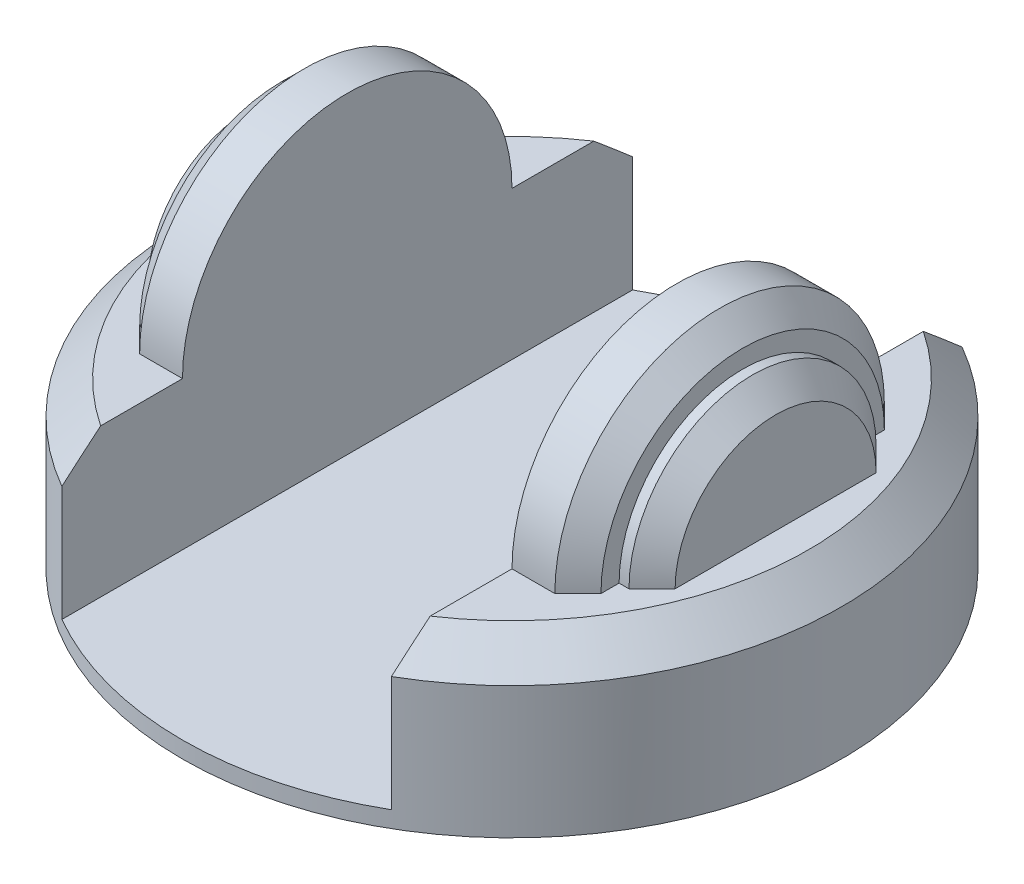
ISO-10303-21;
HEADER;
FILE_DESCRIPTION(('STEP AP214'),'2;1');
FILE_NAME('part.step','',(''),(''),'','','');
FILE_SCHEMA(('AUTOMOTIVE_DESIGN { 1 0 10303 214 1 1 1 1 }'));
ENDSEC;
DATA;
#1=APPLICATION_CONTEXT('core data for automotive mechanical design processes');
#2=APPLICATION_PROTOCOL_DEFINITION('international standard','automotive_design',2000,#1);
#3=PRODUCT_CONTEXT('',#1,'mechanical');
#4=PRODUCT('Part','Part','',(#3));
#5=PRODUCT_RELATED_PRODUCT_CATEGORY('part','',(#4));
#6=PRODUCT_DEFINITION_FORMATION('','',#4);
#7=PRODUCT_DEFINITION_CONTEXT('part definition',#1,'design');
#8=PRODUCT_DEFINITION('design','',#6,#7);
#9=PRODUCT_DEFINITION_SHAPE('','',#8);
#10=(LENGTH_UNIT() NAMED_UNIT(*) SI_UNIT(.MILLI.,.METRE.));
#11=(NAMED_UNIT(*) PLANE_ANGLE_UNIT() SI_UNIT($,.RADIAN.));
#12=(NAMED_UNIT(*) SI_UNIT($,.STERADIAN.) SOLID_ANGLE_UNIT());
#13=UNCERTAINTY_MEASURE_WITH_UNIT(LENGTH_MEASURE(1.E-05),#10,'distance_accuracy_value','');
#14=(GEOMETRIC_REPRESENTATION_CONTEXT(3) GLOBAL_UNCERTAINTY_ASSIGNED_CONTEXT((#13)) GLOBAL_UNIT_ASSIGNED_CONTEXT((#10,
#11,#12)) REPRESENTATION_CONTEXT('',''));
#15=CARTESIAN_POINT('',(0.,0.,0.));
#16=DIRECTION('',(0.,0.,1.));
#17=DIRECTION('',(1.,0.,0.));
#18=AXIS2_PLACEMENT_3D('',#15,#16,#17);
#19=CARTESIAN_POINT('',(0.,50.,0.));
#20=DIRECTION('',(0.,1.,0.));
#21=DIRECTION('',(0.,0.,1.));
#22=AXIS2_PLACEMENT_3D('',#19,#20,#21);
#23=PLANE('',#22);
#24=DIRECTION('',(0.,0.,-1.));
#25=VECTOR('',#24,1.);
#26=CARTESIAN_POINT('',(50.,50.,0.));
#27=LINE('',#26,#25);
#28=CARTESIAN_POINT('',(50.,50.,74.8331477354788));
#29=VERTEX_POINT('',#28);
#30=CARTESIAN_POINT('',(50.,50.,50.));
#31=VERTEX_POINT('',#30);
#32=EDGE_CURVE('E214',#29,#31,#27,.T.);
#33=ORIENTED_EDGE('',*,*,#32,.F.);
#34=CARTESIAN_POINT('',(0.,50.,0.));
#35=DIRECTION('',(0.,1.,0.));
#36=DIRECTION('',(0.,0.,1.));
#37=AXIS2_PLACEMENT_3D('',#34,#35,#36);
#38=CIRCLE('',#37,90.);
#39=CARTESIAN_POINT('',(50.,50.,-74.8331477354788));
#40=VERTEX_POINT('',#39);
#41=EDGE_CURVE('E569',#29,#40,#38,.T.);
#42=ORIENTED_EDGE('',*,*,#41,.T.);
#43=CARTESIAN_POINT('',(50.,50.,-50.));
#44=VERTEX_POINT('',#43);
#45=EDGE_CURVE('E213',#44,#40,#27,.T.);
#46=ORIENTED_EDGE('',*,*,#45,.F.);
#47=DIRECTION('',(-1.,0.,0.));
#48=VECTOR('',#47,1.);
#49=CARTESIAN_POINT('',(70.,50.,-50.));
#50=LINE('',#49,#48);
#51=CARTESIAN_POINT('',(63.,50.,-50.));
#52=VERTEX_POINT('',#51);
#53=EDGE_CURVE('E366',#44,#52,#50,.F.);
#54=ORIENTED_EDGE('',*,*,#53,.T.);
#55=DIRECTION('',(-0.707106781186547,0.,-0.707106781186548));
#56=VECTOR('',#55,1.);
#57=CARTESIAN_POINT('',(113.,50.,0.));
#58=LINE('',#57,#56);
#59=CARTESIAN_POINT('',(70.,50.,-43.));
#60=VERTEX_POINT('',#59);
#61=EDGE_CURVE('E11',#52,#60,#58,.F.);
#62=ORIENTED_EDGE('',*,*,#61,.T.);
#63=DIRECTION('',(0.,0.,1.));
#64=VECTOR('',#63,1.);
#65=CARTESIAN_POINT('',(70.,50.,0.));
#66=LINE('',#65,#64);
#67=CARTESIAN_POINT('',(70.,50.,-37.5));
#68=VERTEX_POINT('',#67);
#69=EDGE_CURVE('E361',#60,#68,#66,.T.);
#70=ORIENTED_EDGE('',*,*,#69,.T.);
#71=DIRECTION('',(-1.,0.,0.));
#72=VECTOR('',#71,1.);
#73=CARTESIAN_POINT('',(80.,50.,-37.5));
#74=LINE('',#73,#72);
#75=CARTESIAN_POINT('',(73.,50.,-37.5));
#76=VERTEX_POINT('',#75);
#77=EDGE_CURVE('E373',#68,#76,#74,.F.);
#78=ORIENTED_EDGE('',*,*,#77,.T.);
#79=DIRECTION('',(-0.707106781186549,0.,-0.707106781186546));
#80=VECTOR('',#79,1.);
#81=CARTESIAN_POINT('',(110.5,50.,0.));
#82=LINE('',#81,#80);
#83=CARTESIAN_POINT('',(80.,50.,-30.5));
#84=VERTEX_POINT('',#83);
#85=EDGE_CURVE('E398',#76,#84,#82,.F.);
#86=ORIENTED_EDGE('',*,*,#85,.T.);
#87=DIRECTION('',(0.,0.,-1.));
#88=VECTOR('',#87,1.);
#89=CARTESIAN_POINT('',(80.,50.,0.));
#90=LINE('',#89,#88);
#91=CARTESIAN_POINT('',(80.,50.,30.5));
#92=VERTEX_POINT('',#91);
#93=EDGE_CURVE('E221',#92,#84,#90,.T.);
#94=ORIENTED_EDGE('',*,*,#93,.F.);
#95=DIRECTION('',(0.707106781186549,0.,-0.707106781186546));
#96=VECTOR('',#95,1.);
#97=CARTESIAN_POINT('',(110.5,50.,0.));
#98=LINE('',#97,#96);
#99=CARTESIAN_POINT('',(73.,50.,37.5));
#100=VERTEX_POINT('',#99);
#101=EDGE_CURVE('E395',#92,#100,#98,.F.);
#102=ORIENTED_EDGE('',*,*,#101,.T.);
#103=DIRECTION('',(-1.,0.,0.));
#104=VECTOR('',#103,1.);
#105=CARTESIAN_POINT('',(80.,50.,37.5));
#106=LINE('',#105,#104);
#107=CARTESIAN_POINT('',(70.,50.,37.5));
#108=VERTEX_POINT('',#107);
#109=EDGE_CURVE('E376',#100,#108,#106,.T.);
#110=ORIENTED_EDGE('',*,*,#109,.T.);
#111=CARTESIAN_POINT('',(70.,50.,43.));
#112=VERTEX_POINT('',#111);
#113=EDGE_CURVE('E363',#108,#112,#66,.T.);
#114=ORIENTED_EDGE('',*,*,#113,.T.);
#115=DIRECTION('',(0.707106781186547,0.,-0.707106781186548));
#116=VECTOR('',#115,1.);
#117=CARTESIAN_POINT('',(113.,50.,0.));
#118=LINE('',#117,#116);
#119=CARTESIAN_POINT('',(63.,50.,50.));
#120=VERTEX_POINT('',#119);
#121=EDGE_CURVE('E44',#112,#120,#118,.F.);
#122=ORIENTED_EDGE('',*,*,#121,.T.);
#123=DIRECTION('',(-1.,0.,0.));
#124=VECTOR('',#123,1.);
#125=CARTESIAN_POINT('',(70.,50.,50.));
#126=LINE('',#125,#124);
#127=EDGE_CURVE('E368',#120,#31,#126,.T.);
#128=ORIENTED_EDGE('',*,*,#127,.T.);
#129=EDGE_LOOP('',(#33,#42,#46,#54,#62,#70,#78,#86,#94,#102,#110,#114,#122,#128));
#130=FACE_BOUND('',#129,.T.);
#131=ADVANCED_FACE('F35',(#130),#23,.T.);
#132=CARTESIAN_POINT('',(0.,50.,0.));
#133=DIRECTION('',(0.,-1.,0.));
#134=DIRECTION('',(0.,0.,-1.));
#135=AXIS2_PLACEMENT_3D('',#132,#133,#134);
#136=CYLINDRICAL_SURFACE('',#135,100.);
#137=DIRECTION('',(0.,-1.,0.));
#138=VECTOR('',#137,1.);
#139=CARTESIAN_POINT('',(-50.,50.,86.6025403784439));
#140=LINE('',#139,#138);
#141=CARTESIAN_POINT('',(-50.,5.,86.6025403784439));
#142=VERTEX_POINT('',#141);
#143=CARTESIAN_POINT('',(-50.,39.9999999999999,86.6025403784439));
#144=VERTEX_POINT('',#143);
#145=EDGE_CURVE('E197',#142,#144,#140,.F.);
#146=ORIENTED_EDGE('',*,*,#145,.T.);
#147=CARTESIAN_POINT('',(0.,39.9999999999999,0.));
#148=DIRECTION('',(0.,1.,0.));
#149=DIRECTION('',(0.,0.,1.));
#150=AXIS2_PLACEMENT_3D('',#147,#148,#149);
#151=CIRCLE('',#150,100.);
#152=CARTESIAN_POINT('',(-50.,39.9999999999999,-86.6025403784439));
#153=VERTEX_POINT('',#152);
#154=EDGE_CURVE('E347',#144,#153,#151,.F.);
#155=ORIENTED_EDGE('',*,*,#154,.T.);
#156=DIRECTION('',(0.,-1.,0.));
#157=VECTOR('',#156,1.);
#158=CARTESIAN_POINT('',(-50.,50.,-86.6025403784439));
#159=LINE('',#158,#157);
#160=CARTESIAN_POINT('',(-50.,5.,-86.6025403784439));
#161=VERTEX_POINT('',#160);
#162=EDGE_CURVE('E200',#153,#161,#159,.T.);
#163=ORIENTED_EDGE('',*,*,#162,.T.);
#164=CARTESIAN_POINT('',(0.,5.,0.));
#165=DIRECTION('',(0.,-1.,0.));
#166=DIRECTION('',(0.,0.,-1.));
#167=AXIS2_PLACEMENT_3D('',#164,#165,#166);
#168=CIRCLE('',#167,100.);
#169=CARTESIAN_POINT('',(50.,5.,-86.6025403784439));
#170=VERTEX_POINT('',#169);
#171=EDGE_CURVE('E217',#161,#170,#168,.T.);
#172=ORIENTED_EDGE('',*,*,#171,.T.);
#173=DIRECTION('',(0.,-1.,0.));
#174=VECTOR('',#173,1.);
#175=CARTESIAN_POINT('',(50.,50.,-86.6025403784439));
#176=LINE('',#175,#174);
#177=CARTESIAN_POINT('',(50.,39.9999999999999,-86.6025403784439));
#178=VERTEX_POINT('',#177);
#179=EDGE_CURVE('E202',#170,#178,#176,.F.);
#180=ORIENTED_EDGE('',*,*,#179,.T.);
#181=CARTESIAN_POINT('',(0.,39.9999999999999,0.));
#182=DIRECTION('',(0.,1.,0.));
#183=DIRECTION('',(0.,0.,1.));
#184=AXIS2_PLACEMENT_3D('',#181,#182,#183);
#185=CIRCLE('',#184,100.);
#186=CARTESIAN_POINT('',(50.,39.9999999999999,86.6025403784439));
#187=VERTEX_POINT('',#186);
#188=EDGE_CURVE('E570',#178,#187,#185,.F.);
#189=ORIENTED_EDGE('',*,*,#188,.T.);
#190=DIRECTION('',(0.,-1.,0.));
#191=VECTOR('',#190,1.);
#192=CARTESIAN_POINT('',(50.,50.,86.6025403784439));
#193=LINE('',#192,#191);
#194=CARTESIAN_POINT('',(50.,5.,86.6025403784439));
#195=VERTEX_POINT('',#194);
#196=EDGE_CURVE('E205',#187,#195,#193,.T.);
#197=ORIENTED_EDGE('',*,*,#196,.T.);
#198=EDGE_CURVE('E220',#195,#142,#168,.T.);
#199=ORIENTED_EDGE('',*,*,#198,.T.);
#200=EDGE_LOOP('',(#146,#155,#163,#172,#180,#189,#197,#199));
#201=FACE_BOUND('',#200,.T.);
#202=CARTESIAN_POINT('',(0.,0.,0.));
#203=DIRECTION('',(0.,1.,0.));
#204=DIRECTION('',(0.,0.,1.));
#205=AXIS2_PLACEMENT_3D('',#202,#203,#204);
#206=CIRCLE('',#205,100.);
#207=CARTESIAN_POINT('',(0.,0.,100.));
#208=VERTEX_POINT('',#207);
#209=EDGE_CURVE('E207',#208,#208,#206,.T.);
#210=ORIENTED_EDGE('',*,*,#209,.T.);
#211=EDGE_LOOP('',(#210));
#212=FACE_BOUND('',#211,.T.);
#213=ADVANCED_FACE('F316',(#201,#212),#136,.T.);
#214=DIRECTION('',(0.,0.,1.));
#215=VECTOR('',#214,1.);
#216=CARTESIAN_POINT('',(-50.,50.,0.));
#217=LINE('',#216,#215);
#218=CARTESIAN_POINT('',(-50.,50.,-74.8331477354788));
#219=VERTEX_POINT('',#218);
#220=CARTESIAN_POINT('',(-50.,50.,-50.));
#221=VERTEX_POINT('',#220);
#222=EDGE_CURVE('E211',#219,#221,#217,.T.);
#223=ORIENTED_EDGE('',*,*,#222,.F.);
#224=CARTESIAN_POINT('',(0.,50.,0.));
#225=DIRECTION('',(0.,1.,0.));
#226=DIRECTION('',(0.,0.,1.));
#227=AXIS2_PLACEMENT_3D('',#224,#225,#226);
#228=CIRCLE('',#227,90.);
#229=CARTESIAN_POINT('',(-50.,50.,74.8331477354788));
#230=VERTEX_POINT('',#229);
#231=EDGE_CURVE('E227',#219,#230,#228,.T.);
#232=ORIENTED_EDGE('',*,*,#231,.T.);
#233=CARTESIAN_POINT('',(-50.,50.,50.));
#234=VERTEX_POINT('',#233);
#235=EDGE_CURVE('E210',#234,#230,#217,.T.);
#236=ORIENTED_EDGE('',*,*,#235,.F.);
#237=DIRECTION('',(1.,0.,0.));
#238=VECTOR('',#237,1.);
#239=CARTESIAN_POINT('',(-70.,50.,50.));
#240=LINE('',#239,#238);
#241=CARTESIAN_POINT('',(-62.9999999999999,50.,50.));
#242=VERTEX_POINT('',#241);
#243=EDGE_CURVE('E187',#242,#234,#240,.T.);
#244=ORIENTED_EDGE('',*,*,#243,.F.);
#245=DIRECTION('',(0.707106781186548,0.,0.707106781186547));
#246=VECTOR('',#245,1.);
#247=CARTESIAN_POINT('',(-113.,50.,0.));
#248=LINE('',#247,#246);
#249=CARTESIAN_POINT('',(-70.,50.,42.9999999999999));
#250=VERTEX_POINT('',#249);
#251=EDGE_CURVE('E402',#242,#250,#248,.F.);
#252=ORIENTED_EDGE('',*,*,#251,.T.);
#253=DIRECTION('',(0.,0.,-1.));
#254=VECTOR('',#253,1.);
#255=CARTESIAN_POINT('',(-70.,50.,0.));
#256=LINE('',#255,#254);
#257=CARTESIAN_POINT('',(-70.,50.,37.5));
#258=VERTEX_POINT('',#257);
#259=EDGE_CURVE('E186',#250,#258,#256,.T.);
#260=ORIENTED_EDGE('',*,*,#259,.T.);
#261=DIRECTION('',(1.,0.,0.));
#262=VECTOR('',#261,1.);
#263=CARTESIAN_POINT('',(-80.,50.,37.5));
#264=LINE('',#263,#262);
#265=CARTESIAN_POINT('',(-73.,50.,37.5));
#266=VERTEX_POINT('',#265);
#267=EDGE_CURVE('E168',#266,#258,#264,.T.);
#268=ORIENTED_EDGE('',*,*,#267,.F.);
#269=DIRECTION('',(0.707106781186545,0.,0.70710678118655));
#270=VECTOR('',#269,1.);
#271=CARTESIAN_POINT('',(-110.5,50.,0.));
#272=LINE('',#271,#270);
#273=CARTESIAN_POINT('',(-80.,50.,30.5));
#274=VERTEX_POINT('',#273);
#275=EDGE_CURVE('E407',#266,#274,#272,.F.);
#276=ORIENTED_EDGE('',*,*,#275,.T.);
#277=DIRECTION('',(0.,0.,1.));
#278=VECTOR('',#277,1.);
#279=CARTESIAN_POINT('',(-80.,50.,0.));
#280=LINE('',#279,#278);
#281=CARTESIAN_POINT('',(-80.,50.,-30.5));
#282=VERTEX_POINT('',#281);
#283=EDGE_CURVE('E224',#282,#274,#280,.T.);
#284=ORIENTED_EDGE('',*,*,#283,.F.);
#285=DIRECTION('',(-0.707106781186545,0.,0.70710678118655));
#286=VECTOR('',#285,1.);
#287=CARTESIAN_POINT('',(-110.5,50.,0.));
#288=LINE('',#287,#286);
#289=CARTESIAN_POINT('',(-73.,50.,-37.5));
#290=VERTEX_POINT('',#289);
#291=EDGE_CURVE('E181',#282,#290,#288,.F.);
#292=ORIENTED_EDGE('',*,*,#291,.T.);
#293=DIRECTION('',(1.,0.,0.));
#294=VECTOR('',#293,1.);
#295=CARTESIAN_POINT('',(-80.,50.,-37.5));
#296=LINE('',#295,#294);
#297=CARTESIAN_POINT('',(-70.,50.,-37.5));
#298=VERTEX_POINT('',#297);
#299=EDGE_CURVE('E165',#298,#290,#296,.F.);
#300=ORIENTED_EDGE('',*,*,#299,.F.);
#301=CARTESIAN_POINT('',(-70.,50.,-42.9999999999999));
#302=VERTEX_POINT('',#301);
#303=EDGE_CURVE('E177',#298,#302,#256,.T.);
#304=ORIENTED_EDGE('',*,*,#303,.T.);
#305=DIRECTION('',(-0.707106781186548,0.,0.707106781186547));
#306=VECTOR('',#305,1.);
#307=CARTESIAN_POINT('',(-113.,50.,0.));
#308=LINE('',#307,#306);
#309=CARTESIAN_POINT('',(-62.9999999999999,50.,-50.));
#310=VERTEX_POINT('',#309);
#311=EDGE_CURVE('E399',#302,#310,#308,.F.);
#312=ORIENTED_EDGE('',*,*,#311,.T.);
#313=DIRECTION('',(1.,0.,0.));
#314=VECTOR('',#313,1.);
#315=CARTESIAN_POINT('',(-70.,50.,-50.));
#316=LINE('',#315,#314);
#317=EDGE_CURVE('E190',#221,#310,#316,.F.);
#318=ORIENTED_EDGE('',*,*,#317,.F.);
#319=EDGE_LOOP('',(#223,#232,#236,#244,#252,#260,#268,#276,#284,#292,#300,#304,#312,#318));
#320=FACE_BOUND('',#319,.T.);
#321=ADVANCED_FACE('F176',(#320),#23,.T.);
#322=CARTESIAN_POINT('',(0.,0.,0.));
#323=DIRECTION('',(0.,1.,0.));
#324=DIRECTION('',(0.,0.,1.));
#325=AXIS2_PLACEMENT_3D('',#322,#323,#324);
#326=PLANE('',#325);
#327=ORIENTED_EDGE('',*,*,#209,.F.);
#328=EDGE_LOOP('',(#327));
#329=FACE_BOUND('',#328,.T.);
#330=ADVANCED_FACE('F323',(#329),#326,.F.);
#331=CARTESIAN_POINT('',(0.,5.,0.));
#332=DIRECTION('',(0.,-1.,0.));
#333=DIRECTION('',(0.,0.,-1.));
#334=AXIS2_PLACEMENT_3D('',#331,#332,#333);
#335=PLANE('',#334);
#336=DIRECTION('',(0.,0.,-1.));
#337=VECTOR('',#336,1.);
#338=CARTESIAN_POINT('',(50.,5.,107.135267779761));
#339=LINE('',#338,#337);
#340=EDGE_CURVE('E189',#195,#170,#339,.T.);
#341=ORIENTED_EDGE('',*,*,#340,.T.);
#342=ORIENTED_EDGE('',*,*,#171,.F.);
#343=DIRECTION('',(0.,0.,1.));
#344=VECTOR('',#343,1.);
#345=CARTESIAN_POINT('',(-50.,5.,107.135267779761));
#346=LINE('',#345,#344);
#347=EDGE_CURVE('E195',#161,#142,#346,.T.);
#348=ORIENTED_EDGE('',*,*,#347,.T.);
#349=ORIENTED_EDGE('',*,*,#198,.F.);
#350=EDGE_LOOP('',(#341,#342,#348,#349));
#351=FACE_BOUND('',#350,.T.);
#352=ADVANCED_FACE('F257',(#351),#335,.F.);
#353=CARTESIAN_POINT('',(50.,5.,107.135267779761));
#354=DIRECTION('',(1.,0.,0.));
#355=DIRECTION('',(0.,0.,-1.));
#356=AXIS2_PLACEMENT_3D('',#353,#354,#355);
#357=PLANE('',#356);
#358=ORIENTED_EDGE('',*,*,#45,.T.);
#359=CARTESIAN_POINT('',(50.,50.,-74.8331477354788));
#360=CARTESIAN_POINT('',(50.,49.1771253740356,-75.8227769251843));
#361=CARTESIAN_POINT('',(50.,48.351296436479,-76.8099446175592));
#362=CARTESIAN_POINT('',(50.,46.6942668321052,-78.7797197788817));
#363=CARTESIAN_POINT('',(50.,45.863066300409,-79.7623273614776));
#364=CARTESIAN_POINT('',(50.,44.1957922637268,-81.7233909233282));
#365=CARTESIAN_POINT('',(50.,43.3597187771789,-82.7018469182673));
#366=CARTESIAN_POINT('',(50.,41.6831009153428,-84.6549639791113));
#367=CARTESIAN_POINT('',(50.,40.8425564285906,-85.6296249493455));
#368=CARTESIAN_POINT('',(50.,39.9999999999999,-86.6025403784439));
#369=B_SPLINE_CURVE_WITH_KNOTS('',3,(#359,#360,#361,#362,#363,#364,#365,#366,#367,#368),
.UNSPECIFIED.,.F.,.F.,(4,2,2,2,4),(0.,3.86112810063912,7.72215945083976,11.5831762013222,
15.4442896640597),.UNSPECIFIED.);
#370=EDGE_CURVE('E274',#40,#178,#369,.T.);
#371=ORIENTED_EDGE('',*,*,#370,.T.);
#372=ORIENTED_EDGE('',*,*,#179,.F.);
#373=ORIENTED_EDGE('',*,*,#340,.F.);
#374=ORIENTED_EDGE('',*,*,#196,.F.);
#375=CARTESIAN_POINT('',(50.,39.9999999999999,86.6025403784439));
#376=CARTESIAN_POINT('',(50.,40.8425564285906,85.6296249493455));
#377=CARTESIAN_POINT('',(50.,41.6831009153428,84.6549639791113));
#378=CARTESIAN_POINT('',(50.,43.3597187771789,82.7018469182673));
#379=CARTESIAN_POINT('',(50.,44.1957922637268,81.7233909233281));
#380=CARTESIAN_POINT('',(50.,45.863066300409,79.7623273614776));
#381=CARTESIAN_POINT('',(50.,46.6942668321052,78.7797197788817));
#382=CARTESIAN_POINT('',(50.,48.351296436479,76.8099446175592));
#383=CARTESIAN_POINT('',(50.,49.1771253740357,75.8227769251843));
#384=CARTESIAN_POINT('',(50.,50.,74.8331477354788));
#385=B_SPLINE_CURVE_WITH_KNOTS('',3,(#375,#376,#377,#378,#379,#380,#381,#382,#383,#384),
.UNSPECIFIED.,.F.,.F.,(4,2,2,2,4),(0.,3.86111346273751,7.72213021321996,11.5831615634206,
15.4442896640597),.UNSPECIFIED.);
#386=EDGE_CURVE('E267',#187,#29,#385,.T.);
#387=ORIENTED_EDGE('',*,*,#386,.T.);
#388=ORIENTED_EDGE('',*,*,#32,.T.);
#389=CARTESIAN_POINT('',(50.,50.,0.));
#390=DIRECTION('',(1.,0.,0.));
#391=DIRECTION('',(0.,0.,-1.));
#392=AXIS2_PLACEMENT_3D('',#389,#390,#391);
#393=CIRCLE('',#392,50.);
#394=EDGE_CURVE('E370',#44,#31,#393,.T.);
#395=ORIENTED_EDGE('',*,*,#394,.F.);
#396=EDGE_LOOP('',(#358,#371,#372,#373,#374,#387,#388,#395));
#397=FACE_BOUND('',#396,.T.);
#398=ADVANCED_FACE('F255',(#397),#357,.F.);
#399=CARTESIAN_POINT('',(-50.,5.,107.135267779761));
#400=DIRECTION('',(-1.,0.,0.));
#401=DIRECTION('',(0.,0.,1.));
#402=AXIS2_PLACEMENT_3D('',#399,#400,#401);
#403=PLANE('',#402);
#404=ORIENTED_EDGE('',*,*,#235,.T.);
#405=CARTESIAN_POINT('',(-50.,50.,74.8331477354788));
#406=CARTESIAN_POINT('',(-50.,49.1771253740356,75.8227769251843));
#407=CARTESIAN_POINT('',(-50.,48.351296436479,76.8099446175592));
#408=CARTESIAN_POINT('',(-50.,46.6942668321052,78.7797197788817));
#409=CARTESIAN_POINT('',(-50.,45.863066300409,79.7623273614776));
#410=CARTESIAN_POINT('',(-50.,44.1957922637268,81.7233909233281));
#411=CARTESIAN_POINT('',(-50.,43.3597187771789,82.7018469182672));
#412=CARTESIAN_POINT('',(-50.,41.6831009153427,84.6549639791113));
#413=CARTESIAN_POINT('',(-50.,40.8425564285906,85.6296249493455));
#414=CARTESIAN_POINT('',(-50.,39.9999999999999,86.6025403784439));
#415=B_SPLINE_CURVE_WITH_KNOTS('',3,(#405,#406,#407,#408,#409,#410,#411,#412,#413,#414),
.UNSPECIFIED.,.F.,.F.,(4,2,2,2,4),(0.,3.86112810063914,7.72215945083976,11.5831762013222,
15.4442896640597),.UNSPECIFIED.);
#416=EDGE_CURVE('E238',#230,#144,#415,.T.);
#417=ORIENTED_EDGE('',*,*,#416,.T.);
#418=ORIENTED_EDGE('',*,*,#145,.F.);
#419=ORIENTED_EDGE('',*,*,#347,.F.);
#420=ORIENTED_EDGE('',*,*,#162,.F.);
#421=CARTESIAN_POINT('',(-50.,39.9999999999999,-86.6025403784439));
#422=CARTESIAN_POINT('',(-50.,40.8425564285906,-85.6296249493455));
#423=CARTESIAN_POINT('',(-50.,41.6831009153428,-84.6549639791113));
#424=CARTESIAN_POINT('',(-50.,43.3597187771788,-82.7018469182673));
#425=CARTESIAN_POINT('',(-50.,44.1957922637267,-81.7233909233281));
#426=CARTESIAN_POINT('',(-50.,45.863066300409,-79.7623273614776));
#427=CARTESIAN_POINT('',(-50.,46.6942668321052,-78.7797197788817));
#428=CARTESIAN_POINT('',(-50.,48.351296436479,-76.8099446175592));
#429=CARTESIAN_POINT('',(-50.,49.1771253740356,-75.8227769251843));
#430=CARTESIAN_POINT('',(-50.,50.,-74.8331477354788));
#431=B_SPLINE_CURVE_WITH_KNOTS('',3,(#421,#422,#423,#424,#425,#426,#427,#428,#429,#430),
.UNSPECIFIED.,.F.,.F.,(4,2,2,2,4),(0.,3.86111346273749,7.72213021321994,11.5831615634206,
15.4442896640597),.UNSPECIFIED.);
#432=EDGE_CURVE('E230',#153,#219,#431,.T.);
#433=ORIENTED_EDGE('',*,*,#432,.T.);
#434=ORIENTED_EDGE('',*,*,#222,.T.);
#435=CARTESIAN_POINT('',(-50.,50.,0.));
#436=DIRECTION('',(1.,0.,0.));
#437=DIRECTION('',(0.,0.,-1.));
#438=AXIS2_PLACEMENT_3D('',#435,#436,#437);
#439=CIRCLE('',#438,50.);
#440=EDGE_CURVE('E358',#221,#234,#439,.T.);
#441=ORIENTED_EDGE('',*,*,#440,.T.);
#442=EDGE_LOOP('',(#404,#417,#418,#419,#420,#433,#434,#441));
#443=FACE_BOUND('',#442,.T.);
#444=ADVANCED_FACE('F249',(#443),#403,.F.);
#445=CARTESIAN_POINT('',(-70.,50.,0.));
#446=DIRECTION('',(1.,0.,0.));
#447=DIRECTION('',(0.,0.,-1.));
#448=AXIS2_PLACEMENT_3D('',#445,#446,#447);
#449=CYLINDRICAL_SURFACE('',#448,50.);
#450=ORIENTED_EDGE('',*,*,#317,.T.);
#451=CARTESIAN_POINT('',(-62.9999999999999,50.,0.));
#452=DIRECTION('',(1.,0.,0.));
#453=DIRECTION('',(0.,0.,-1.));
#454=AXIS2_PLACEMENT_3D('',#451,#452,#453);
#455=CIRCLE('',#454,50.);
#456=EDGE_CURVE('E416',#310,#242,#455,.T.);
#457=ORIENTED_EDGE('',*,*,#456,.T.);
#458=ORIENTED_EDGE('',*,*,#243,.T.);
#459=ORIENTED_EDGE('',*,*,#440,.F.);
#460=EDGE_LOOP('',(#450,#457,#458,#459));
#461=FACE_BOUND('',#460,.T.);
#462=ADVANCED_FACE('F254',(#461),#449,.T.);
#463=CARTESIAN_POINT('',(-70.,50.,0.));
#464=DIRECTION('',(1.,0.,0.));
#465=DIRECTION('',(0.,0.,-1.));
#466=AXIS2_PLACEMENT_3D('',#463,#464,#465);
#467=PLANE('',#466);
#468=ORIENTED_EDGE('',*,*,#259,.F.);
#469=CARTESIAN_POINT('',(-70.,50.,0.));
#470=DIRECTION('',(1.,0.,0.));
#471=DIRECTION('',(0.,0.,-1.));
#472=AXIS2_PLACEMENT_3D('',#469,#470,#471);
#473=CIRCLE('',#472,42.9999999999999);
#474=EDGE_CURVE('E185',#250,#302,#473,.F.);
#475=ORIENTED_EDGE('',*,*,#474,.T.);
#476=ORIENTED_EDGE('',*,*,#303,.F.);
#477=CARTESIAN_POINT('',(-70.,50.,0.));
#478=DIRECTION('',(1.,0.,0.));
#479=DIRECTION('',(0.,0.,-1.));
#480=AXIS2_PLACEMENT_3D('',#477,#478,#479);
#481=CIRCLE('',#480,37.5);
#482=EDGE_CURVE('E161',#298,#258,#481,.T.);
#483=ORIENTED_EDGE('',*,*,#482,.T.);
#484=EDGE_LOOP('',(#468,#475,#476,#483));
#485=FACE_BOUND('',#484,.T.);
#486=ADVANCED_FACE('F183',(#485),#467,.F.);
#487=CARTESIAN_POINT('',(70.,50.,0.));
#488=DIRECTION('',(-1.,0.,0.));
#489=DIRECTION('',(0.,0.,1.));
#490=AXIS2_PLACEMENT_3D('',#487,#488,#489);
#491=CYLINDRICAL_SURFACE('',#490,50.);
#492=ORIENTED_EDGE('',*,*,#127,.F.);
#493=CARTESIAN_POINT('',(63.,50.,0.));
#494=DIRECTION('',(-1.,0.,0.));
#495=DIRECTION('',(0.,0.,1.));
#496=AXIS2_PLACEMENT_3D('',#493,#494,#495);
#497=CIRCLE('',#496,50.);
#498=EDGE_CURVE('E57',#120,#52,#497,.T.);
#499=ORIENTED_EDGE('',*,*,#498,.T.);
#500=ORIENTED_EDGE('',*,*,#53,.F.);
#501=ORIENTED_EDGE('',*,*,#394,.T.);
#502=EDGE_LOOP('',(#492,#499,#500,#501));
#503=FACE_BOUND('',#502,.T.);
#504=ADVANCED_FACE('F426',(#503),#491,.T.);
#505=CARTESIAN_POINT('',(70.,50.,0.));
#506=DIRECTION('',(-1.,0.,0.));
#507=DIRECTION('',(0.,0.,-1.));
#508=AXIS2_PLACEMENT_3D('',#505,#506,#507);
#509=PLANE('',#508);
#510=ORIENTED_EDGE('',*,*,#69,.F.);
#511=CARTESIAN_POINT('',(70.,50.,0.));
#512=DIRECTION('',(-1.,0.,0.));
#513=DIRECTION('',(0.,0.,1.));
#514=AXIS2_PLACEMENT_3D('',#511,#512,#513);
#515=CIRCLE('',#514,43.);
#516=EDGE_CURVE('E393',#60,#112,#515,.F.);
#517=ORIENTED_EDGE('',*,*,#516,.T.);
#518=ORIENTED_EDGE('',*,*,#113,.F.);
#519=CARTESIAN_POINT('',(70.,50.,0.));
#520=DIRECTION('',(1.,0.,0.));
#521=DIRECTION('',(0.,0.,-1.));
#522=AXIS2_PLACEMENT_3D('',#519,#520,#521);
#523=CIRCLE('',#522,37.5);
#524=EDGE_CURVE('E378',#68,#108,#523,.T.);
#525=ORIENTED_EDGE('',*,*,#524,.F.);
#526=EDGE_LOOP('',(#510,#517,#518,#525));
#527=FACE_BOUND('',#526,.T.);
#528=ADVANCED_FACE('F390',(#527),#509,.F.);
#529=CARTESIAN_POINT('',(80.,50.,0.));
#530=DIRECTION('',(-1.,0.,0.));
#531=DIRECTION('',(0.,0.,1.));
#532=AXIS2_PLACEMENT_3D('',#529,#530,#531);
#533=CYLINDRICAL_SURFACE('',#532,37.5);
#534=ORIENTED_EDGE('',*,*,#109,.F.);
#535=CARTESIAN_POINT('',(73.,50.,0.));
#536=DIRECTION('',(1.,0.,0.));
#537=DIRECTION('',(0.,0.,-1.));
#538=AXIS2_PLACEMENT_3D('',#535,#536,#537);
#539=CIRCLE('',#538,37.5);
#540=EDGE_CURVE('E411',#100,#76,#539,.F.);
#541=ORIENTED_EDGE('',*,*,#540,.T.);
#542=ORIENTED_EDGE('',*,*,#77,.F.);
#543=ORIENTED_EDGE('',*,*,#524,.T.);
#544=EDGE_LOOP('',(#534,#541,#542,#543));
#545=FACE_BOUND('',#544,.T.);
#546=ADVANCED_FACE('F385',(#545),#533,.T.);
#547=CARTESIAN_POINT('',(80.,50.,0.));
#548=DIRECTION('',(1.,0.,0.));
#549=DIRECTION('',(0.,0.,-1.));
#550=AXIS2_PLACEMENT_3D('',#547,#548,#549);
#551=PLANE('',#550);
#552=ORIENTED_EDGE('',*,*,#93,.T.);
#553=CARTESIAN_POINT('',(80.,50.,0.));
#554=DIRECTION('',(1.,0.,0.));
#555=DIRECTION('',(0.,0.,-1.));
#556=AXIS2_PLACEMENT_3D('',#553,#554,#555);
#557=CIRCLE('',#556,30.5);
#558=EDGE_CURVE('E413',#84,#92,#557,.T.);
#559=ORIENTED_EDGE('',*,*,#558,.T.);
#560=EDGE_LOOP('',(#552,#559));
#561=FACE_BOUND('',#560,.T.);
#562=ADVANCED_FACE('F435',(#561),#551,.T.);
#563=CARTESIAN_POINT('',(-80.,50.,0.));
#564=DIRECTION('',(1.,0.,0.));
#565=DIRECTION('',(0.,0.,-1.));
#566=AXIS2_PLACEMENT_3D('',#563,#564,#565);
#567=CYLINDRICAL_SURFACE('',#566,37.5);
#568=ORIENTED_EDGE('',*,*,#299,.T.);
#569=CARTESIAN_POINT('',(-73.,50.,0.));
#570=DIRECTION('',(-1.,0.,0.));
#571=DIRECTION('',(0.,0.,1.));
#572=AXIS2_PLACEMENT_3D('',#569,#570,#571);
#573=CIRCLE('',#572,37.5);
#574=EDGE_CURVE('E280',#290,#266,#573,.F.);
#575=ORIENTED_EDGE('',*,*,#574,.T.);
#576=ORIENTED_EDGE('',*,*,#267,.T.);
#577=ORIENTED_EDGE('',*,*,#482,.F.);
#578=EDGE_LOOP('',(#568,#575,#576,#577));
#579=FACE_BOUND('',#578,.T.);
#580=ADVANCED_FACE('F163',(#579),#567,.T.);
#581=CARTESIAN_POINT('',(-80.,50.,0.));
#582=DIRECTION('',(-1.,0.,0.));
#583=DIRECTION('',(0.,0.,-1.));
#584=AXIS2_PLACEMENT_3D('',#581,#582,#583);
#585=PLANE('',#584);
#586=ORIENTED_EDGE('',*,*,#283,.T.);
#587=CARTESIAN_POINT('',(-80.,50.,0.));
#588=DIRECTION('',(-1.,0.,0.));
#589=DIRECTION('',(0.,0.,1.));
#590=AXIS2_PLACEMENT_3D('',#587,#588,#589);
#591=CIRCLE('',#590,30.5);
#592=EDGE_CURVE('E418',#274,#282,#591,.T.);
#593=ORIENTED_EDGE('',*,*,#592,.T.);
#594=EDGE_LOOP('',(#586,#593));
#595=FACE_BOUND('',#594,.T.);
#596=ADVANCED_FACE('F441',(#595),#585,.T.);
#597=CARTESIAN_POINT('',(0.,50.,0.));
#598=DIRECTION('',(0.,-1.,0.));
#599=DIRECTION('',(0.,0.,-1.));
#600=AXIS2_PLACEMENT_3D('',#597,#598,#599);
#601=CONICAL_SURFACE('',#600,90.,0.785398163397443);
#602=ORIENTED_EDGE('',*,*,#432,.F.);
#603=ORIENTED_EDGE('',*,*,#154,.F.);
#604=ORIENTED_EDGE('',*,*,#416,.F.);
#605=ORIENTED_EDGE('',*,*,#231,.F.);
#606=EDGE_LOOP('',(#602,#603,#604,#605));
#607=FACE_BOUND('',#606,.T.);
#608=ADVANCED_FACE('F245',(#607),#601,.T.);
#609=CARTESIAN_POINT('',(0.,50.,0.));
#610=DIRECTION('',(0.,-1.,0.));
#611=DIRECTION('',(0.,0.,-1.));
#612=AXIS2_PLACEMENT_3D('',#609,#610,#611);
#613=CONICAL_SURFACE('',#612,90.,0.785398163397443);
#614=ORIENTED_EDGE('',*,*,#386,.F.);
#615=ORIENTED_EDGE('',*,*,#188,.F.);
#616=ORIENTED_EDGE('',*,*,#370,.F.);
#617=ORIENTED_EDGE('',*,*,#41,.F.);
#618=EDGE_LOOP('',(#614,#615,#616,#617));
#619=FACE_BOUND('',#618,.T.);
#620=ADVANCED_FACE('F283',(#619),#613,.T.);
#621=CARTESIAN_POINT('',(-73.,50.,0.));
#622=DIRECTION('',(1.,0.,0.));
#623=DIRECTION('',(0.,0.,-1.));
#624=AXIS2_PLACEMENT_3D('',#621,#622,#623);
#625=CONICAL_SURFACE('',#624,37.5,0.785398163397452);
#626=ORIENTED_EDGE('',*,*,#291,.F.);
#627=ORIENTED_EDGE('',*,*,#592,.F.);
#628=ORIENTED_EDGE('',*,*,#275,.F.);
#629=ORIENTED_EDGE('',*,*,#574,.F.);
#630=EDGE_LOOP('',(#626,#627,#628,#629));
#631=FACE_BOUND('',#630,.T.);
#632=ADVANCED_FACE('F290',(#631),#625,.T.);
#633=CARTESIAN_POINT('',(-62.9999999999999,50.,0.));
#634=DIRECTION('',(1.,0.,0.));
#635=DIRECTION('',(0.,0.,-1.));
#636=AXIS2_PLACEMENT_3D('',#633,#634,#635);
#637=CONICAL_SURFACE('',#636,50.,0.785398163397447);
#638=ORIENTED_EDGE('',*,*,#311,.F.);
#639=ORIENTED_EDGE('',*,*,#474,.F.);
#640=ORIENTED_EDGE('',*,*,#251,.F.);
#641=ORIENTED_EDGE('',*,*,#456,.F.);
#642=EDGE_LOOP('',(#638,#639,#640,#641));
#643=FACE_BOUND('',#642,.T.);
#644=ADVANCED_FACE('F298',(#643),#637,.T.);
#645=CARTESIAN_POINT('',(80.,50.,0.));
#646=DIRECTION('',(-1.,0.,0.));
#647=DIRECTION('',(0.,0.,1.));
#648=AXIS2_PLACEMENT_3D('',#645,#646,#647);
#649=CONICAL_SURFACE('',#648,30.5,0.785398163397446);
#650=ORIENTED_EDGE('',*,*,#85,.F.);
#651=ORIENTED_EDGE('',*,*,#540,.F.);
#652=ORIENTED_EDGE('',*,*,#101,.F.);
#653=ORIENTED_EDGE('',*,*,#558,.F.);
#654=EDGE_LOOP('',(#650,#651,#652,#653));
#655=FACE_BOUND('',#654,.T.);
#656=ADVANCED_FACE('F304',(#655),#649,.T.);
#657=CARTESIAN_POINT('',(70.,50.,0.));
#658=DIRECTION('',(-1.,0.,0.));
#659=DIRECTION('',(0.,0.,1.));
#660=AXIS2_PLACEMENT_3D('',#657,#658,#659);
#661=CONICAL_SURFACE('',#660,43.,0.785398163397449);
#662=ORIENTED_EDGE('',*,*,#61,.F.);
#663=ORIENTED_EDGE('',*,*,#498,.F.);
#664=ORIENTED_EDGE('',*,*,#121,.F.);
#665=ORIENTED_EDGE('',*,*,#516,.F.);
#666=EDGE_LOOP('',(#662,#663,#664,#665));
#667=FACE_BOUND('',#666,.T.);
#668=ADVANCED_FACE('F38',(#667),#661,.T.);
#669=CLOSED_SHELL('',(#131,#213,#321,#330,#352,#398,#444,#462,#486,#504,#528,#546,#562,#580,
#596,#608,#620,#632,#644,#656,#668));
#670=MANIFOLD_SOLID_BREP('B2',#669);
#671=ADVANCED_BREP_SHAPE_REPRESENTATION('',(#18,#670),#14);
#672=SHAPE_DEFINITION_REPRESENTATION(#9,#671);
ENDSEC;
END-ISO-10303-21;
